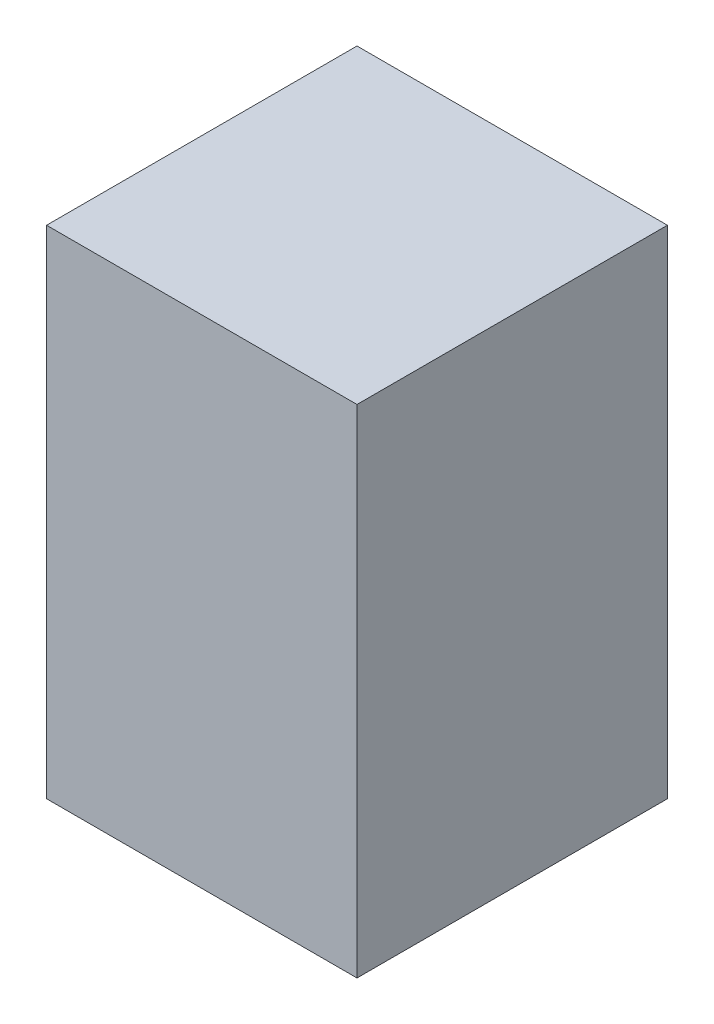
ISO-10303-21;
HEADER;
FILE_DESCRIPTION(('STEP AP214'),'2;1');
FILE_NAME('part.step','',(''),(''),'','','');
FILE_SCHEMA(('AUTOMOTIVE_DESIGN { 1 0 10303 214 1 1 1 1 }'));
ENDSEC;
DATA;
#1=APPLICATION_CONTEXT('core data for automotive mechanical design processes');
#2=APPLICATION_PROTOCOL_DEFINITION('international standard','automotive_design',2000,#1);
#3=PRODUCT_CONTEXT('',#1,'mechanical');
#4=PRODUCT('Part','Part','',(#3));
#5=PRODUCT_RELATED_PRODUCT_CATEGORY('part','',(#4));
#6=PRODUCT_DEFINITION_FORMATION('','',#4);
#7=PRODUCT_DEFINITION_CONTEXT('part definition',#1,'design');
#8=PRODUCT_DEFINITION('design','',#6,#7);
#9=PRODUCT_DEFINITION_SHAPE('','',#8);
#10=(LENGTH_UNIT() NAMED_UNIT(*) SI_UNIT(.MILLI.,.METRE.));
#11=(NAMED_UNIT(*) PLANE_ANGLE_UNIT() SI_UNIT($,.RADIAN.));
#12=(NAMED_UNIT(*) SI_UNIT($,.STERADIAN.) SOLID_ANGLE_UNIT());
#13=UNCERTAINTY_MEASURE_WITH_UNIT(LENGTH_MEASURE(1.E-05),#10,'distance_accuracy_value','');
#14=(GEOMETRIC_REPRESENTATION_CONTEXT(3) GLOBAL_UNCERTAINTY_ASSIGNED_CONTEXT((#13)) GLOBAL_UNIT_ASSIGNED_CONTEXT((#10,
#11,#12)) REPRESENTATION_CONTEXT('',''));
#15=CARTESIAN_POINT('',(0.,0.,0.));
#16=DIRECTION('',(0.,0.,1.));
#17=DIRECTION('',(1.,0.,0.));
#18=AXIS2_PLACEMENT_3D('',#15,#16,#17);
#19=CARTESIAN_POINT('',(0.,0.,500.));
#20=DIRECTION('',(1.,0.,0.));
#21=DIRECTION('',(0.,0.,-1.));
#22=AXIS2_PLACEMENT_3D('',#19,#20,#21);
#23=PLANE('',#22);
#24=DIRECTION('',(0.,-1.,0.));
#25=VECTOR('',#24,1.);
#26=CARTESIAN_POINT('',(0.,0.,0.));
#27=LINE('',#26,#25);
#28=CARTESIAN_POINT('',(0.,800.,0.));
#29=VERTEX_POINT('',#28);
#30=CARTESIAN_POINT('',(0.,0.,0.));
#31=VERTEX_POINT('',#30);
#32=EDGE_CURVE('E107',#29,#31,#27,.T.);
#33=ORIENTED_EDGE('',*,*,#32,.T.);
#34=DIRECTION('',(0.,0.,-1.));
#35=VECTOR('',#34,1.);
#36=CARTESIAN_POINT('',(0.,0.,500.));
#37=LINE('',#36,#35);
#38=CARTESIAN_POINT('',(0.,0.,500.));
#39=VERTEX_POINT('',#38);
#40=EDGE_CURVE('E11',#39,#31,#37,.T.);
#41=ORIENTED_EDGE('',*,*,#40,.F.);
#42=DIRECTION('',(0.,-1.,0.));
#43=VECTOR('',#42,1.);
#44=CARTESIAN_POINT('',(0.,0.,500.));
#45=LINE('',#44,#43);
#46=CARTESIAN_POINT('',(0.,800.,500.));
#47=VERTEX_POINT('',#46);
#48=EDGE_CURVE('E91',#47,#39,#45,.T.);
#49=ORIENTED_EDGE('',*,*,#48,.F.);
#50=DIRECTION('',(0.,0.,-1.));
#51=VECTOR('',#50,1.);
#52=CARTESIAN_POINT('',(0.,800.,500.));
#53=LINE('',#52,#51);
#54=EDGE_CURVE('E103',#47,#29,#53,.T.);
#55=ORIENTED_EDGE('',*,*,#54,.T.);
#56=EDGE_LOOP('',(#33,#41,#49,#55));
#57=FACE_BOUND('',#56,.T.);
#58=ADVANCED_FACE('F39',(#57),#23,.F.);
#59=CARTESIAN_POINT('',(0.,0.,500.));
#60=DIRECTION('',(0.,1.,0.));
#61=DIRECTION('',(0.,0.,1.));
#62=AXIS2_PLACEMENT_3D('',#59,#60,#61);
#63=PLANE('',#62);
#64=DIRECTION('',(1.,0.,0.));
#65=VECTOR('',#64,1.);
#66=CARTESIAN_POINT('',(0.,0.,0.));
#67=LINE('',#66,#65);
#68=CARTESIAN_POINT('',(500.,0.,0.));
#69=VERTEX_POINT('',#68);
#70=EDGE_CURVE('E96',#31,#69,#67,.T.);
#71=ORIENTED_EDGE('',*,*,#70,.T.);
#72=DIRECTION('',(0.,0.,-1.));
#73=VECTOR('',#72,1.);
#74=CARTESIAN_POINT('',(500.,0.,500.));
#75=LINE('',#74,#73);
#76=CARTESIAN_POINT('',(500.,0.,500.));
#77=VERTEX_POINT('',#76);
#78=EDGE_CURVE('E48',#77,#69,#75,.T.);
#79=ORIENTED_EDGE('',*,*,#78,.F.);
#80=DIRECTION('',(1.,0.,0.));
#81=VECTOR('',#80,1.);
#82=CARTESIAN_POINT('',(0.,0.,500.));
#83=LINE('',#82,#81);
#84=EDGE_CURVE('E86',#39,#77,#83,.T.);
#85=ORIENTED_EDGE('',*,*,#84,.F.);
#86=ORIENTED_EDGE('',*,*,#40,.T.);
#87=EDGE_LOOP('',(#71,#79,#85,#86));
#88=FACE_BOUND('',#87,.T.);
#89=ADVANCED_FACE('F95',(#88),#63,.F.);
#90=CARTESIAN_POINT('',(500.,0.,500.));
#91=DIRECTION('',(-1.,0.,0.));
#92=DIRECTION('',(0.,0.,1.));
#93=AXIS2_PLACEMENT_3D('',#90,#91,#92);
#94=PLANE('',#93);
#95=DIRECTION('',(0.,1.,0.));
#96=VECTOR('',#95,1.);
#97=CARTESIAN_POINT('',(500.,0.,0.));
#98=LINE('',#97,#96);
#99=CARTESIAN_POINT('',(500.,800.,0.));
#100=VERTEX_POINT('',#99);
#101=EDGE_CURVE('E73',#69,#100,#98,.T.);
#102=ORIENTED_EDGE('',*,*,#101,.T.);
#103=DIRECTION('',(0.,0.,-1.));
#104=VECTOR('',#103,1.);
#105=CARTESIAN_POINT('',(500.,800.,500.));
#106=LINE('',#105,#104);
#107=CARTESIAN_POINT('',(500.,800.,500.));
#108=VERTEX_POINT('',#107);
#109=EDGE_CURVE('E98',#108,#100,#106,.T.);
#110=ORIENTED_EDGE('',*,*,#109,.F.);
#111=DIRECTION('',(0.,1.,0.));
#112=VECTOR('',#111,1.);
#113=CARTESIAN_POINT('',(500.,0.,500.));
#114=LINE('',#113,#112);
#115=EDGE_CURVE('E89',#77,#108,#114,.T.);
#116=ORIENTED_EDGE('',*,*,#115,.F.);
#117=ORIENTED_EDGE('',*,*,#78,.T.);
#118=EDGE_LOOP('',(#102,#110,#116,#117));
#119=FACE_BOUND('',#118,.T.);
#120=ADVANCED_FACE('F99',(#119),#94,.F.);
#121=CARTESIAN_POINT('',(0.,800.,500.));
#122=DIRECTION('',(0.,-1.,0.));
#123=DIRECTION('',(0.,0.,-1.));
#124=AXIS2_PLACEMENT_3D('',#121,#122,#123);
#125=PLANE('',#124);
#126=DIRECTION('',(-1.,0.,0.));
#127=VECTOR('',#126,1.);
#128=CARTESIAN_POINT('',(0.,800.,0.));
#129=LINE('',#128,#127);
#130=EDGE_CURVE('E79',#100,#29,#129,.T.);
#131=ORIENTED_EDGE('',*,*,#130,.T.);
#132=ORIENTED_EDGE('',*,*,#54,.F.);
#133=DIRECTION('',(-1.,0.,0.));
#134=VECTOR('',#133,1.);
#135=CARTESIAN_POINT('',(0.,800.,500.));
#136=LINE('',#135,#134);
#137=EDGE_CURVE('E56',#108,#47,#136,.T.);
#138=ORIENTED_EDGE('',*,*,#137,.F.);
#139=ORIENTED_EDGE('',*,*,#109,.T.);
#140=EDGE_LOOP('',(#131,#132,#138,#139));
#141=FACE_BOUND('',#140,.T.);
#142=ADVANCED_FACE('F120',(#141),#125,.F.);
#143=CARTESIAN_POINT('',(0.,0.,500.));
#144=DIRECTION('',(0.,0.,-1.));
#145=DIRECTION('',(-1.,0.,0.));
#146=AXIS2_PLACEMENT_3D('',#143,#144,#145);
#147=PLANE('',#146);
#148=ORIENTED_EDGE('',*,*,#48,.T.);
#149=ORIENTED_EDGE('',*,*,#84,.T.);
#150=ORIENTED_EDGE('',*,*,#115,.T.);
#151=ORIENTED_EDGE('',*,*,#137,.T.);
#152=EDGE_LOOP('',(#148,#149,#150,#151));
#153=FACE_BOUND('',#152,.T.);
#154=ADVANCED_FACE('F87',(#153),#147,.F.);
#155=CARTESIAN_POINT('',(0.,0.,0.));
#156=DIRECTION('',(0.,0.,-1.));
#157=DIRECTION('',(-1.,0.,0.));
#158=AXIS2_PLACEMENT_3D('',#155,#156,#157);
#159=PLANE('',#158);
#160=ORIENTED_EDGE('',*,*,#32,.F.);
#161=ORIENTED_EDGE('',*,*,#130,.F.);
#162=ORIENTED_EDGE('',*,*,#101,.F.);
#163=ORIENTED_EDGE('',*,*,#70,.F.);
#164=EDGE_LOOP('',(#160,#161,#162,#163));
#165=FACE_BOUND('',#164,.T.);
#166=ADVANCED_FACE('F123',(#165),#159,.T.);
#167=CLOSED_SHELL('',(#58,#89,#120,#142,#154,#166));
#168=MANIFOLD_SOLID_BREP('B2',#167);
#169=ADVANCED_BREP_SHAPE_REPRESENTATION('',(#18,#168),#14);
#170=SHAPE_DEFINITION_REPRESENTATION(#9,#169);
ENDSEC;
END-ISO-10303-21;
